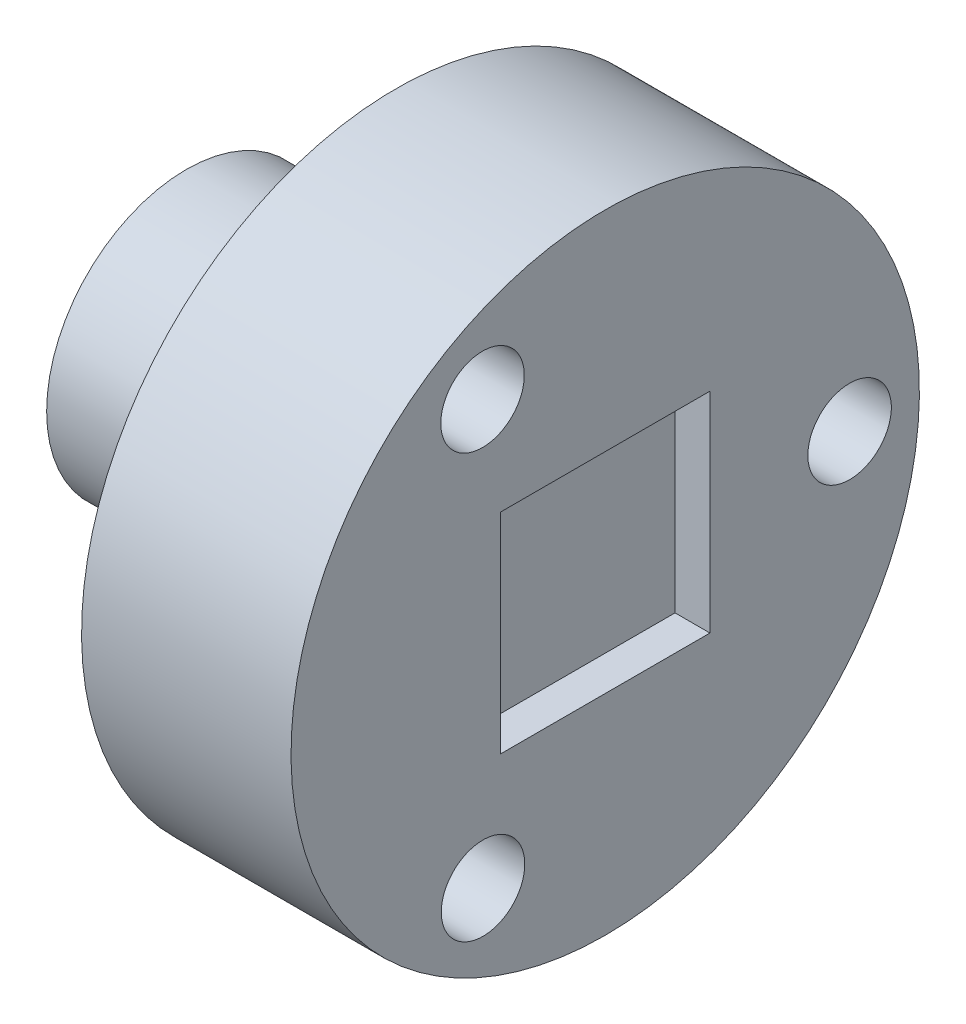
ISO-10303-21;
HEADER;
FILE_DESCRIPTION(('STEP AP214'),'2;1');
FILE_NAME('part.step','',(''),(''),'','','');
FILE_SCHEMA(('AUTOMOTIVE_DESIGN { 1 0 10303 214 1 1 1 1 }'));
ENDSEC;
DATA;
#1=APPLICATION_CONTEXT('core data for automotive mechanical design processes');
#2=APPLICATION_PROTOCOL_DEFINITION('international standard','automotive_design',2000,#1);
#3=PRODUCT_CONTEXT('',#1,'mechanical');
#4=PRODUCT('Part','Part','',(#3));
#5=PRODUCT_RELATED_PRODUCT_CATEGORY('part','',(#4));
#6=PRODUCT_DEFINITION_FORMATION('','',#4);
#7=PRODUCT_DEFINITION_CONTEXT('part definition',#1,'design');
#8=PRODUCT_DEFINITION('design','',#6,#7);
#9=PRODUCT_DEFINITION_SHAPE('','',#8);
#10=(LENGTH_UNIT() NAMED_UNIT(*) SI_UNIT(.MILLI.,.METRE.));
#11=(NAMED_UNIT(*) PLANE_ANGLE_UNIT() SI_UNIT($,.RADIAN.));
#12=(NAMED_UNIT(*) SI_UNIT($,.STERADIAN.) SOLID_ANGLE_UNIT());
#13=UNCERTAINTY_MEASURE_WITH_UNIT(LENGTH_MEASURE(1.E-05),#10,'distance_accuracy_value','');
#14=(GEOMETRIC_REPRESENTATION_CONTEXT(3) GLOBAL_UNCERTAINTY_ASSIGNED_CONTEXT((#13)) GLOBAL_UNIT_ASSIGNED_CONTEXT((#10,
#11,#12)) REPRESENTATION_CONTEXT('',''));
#15=CARTESIAN_POINT('',(0.,0.,0.));
#16=DIRECTION('',(0.,0.,1.));
#17=DIRECTION('',(1.,0.,0.));
#18=AXIS2_PLACEMENT_3D('',#15,#16,#17);
#19=CARTESIAN_POINT('',(-35.2061340470513,0.,0.));
#20=DIRECTION('',(-1.,0.,0.));
#21=DIRECTION('',(0.,-1.,0.));
#22=AXIS2_PLACEMENT_3D('',#19,#20,#21);
#23=CYLINDRICAL_SURFACE('',#22,4.1148);
#24=CARTESIAN_POINT('',(-12.7,0.,0.));
#25=DIRECTION('',(-1.,0.,0.));
#26=DIRECTION('',(0.,-1.,0.));
#27=AXIS2_PLACEMENT_3D('',#24,#25,#26);
#28=CIRCLE('',#27,4.1148);
#29=CARTESIAN_POINT('',(-12.7,-4.1148,0.));
#30=VERTEX_POINT('',#29);
#31=EDGE_CURVE('E133',#30,#30,#28,.T.);
#32=ORIENTED_EDGE('',*,*,#31,.F.);
#33=EDGE_LOOP('',(#32));
#34=FACE_BOUND('',#33,.T.);
#35=CARTESIAN_POINT('',(-19.05,0.,0.));
#36=DIRECTION('',(-1.,0.,0.));
#37=DIRECTION('',(0.,-1.,0.));
#38=AXIS2_PLACEMENT_3D('',#35,#36,#37);
#39=CIRCLE('',#38,4.1148);
#40=CARTESIAN_POINT('',(-19.05,-4.11480000000001,0.));
#41=VERTEX_POINT('',#40);
#42=EDGE_CURVE('E113',#41,#41,#39,.T.);
#43=ORIENTED_EDGE('',*,*,#42,.T.);
#44=EDGE_LOOP('',(#43));
#45=FACE_BOUND('',#44,.T.);
#46=ADVANCED_FACE('F35',(#34,#45),#23,.F.);
#47=CARTESIAN_POINT('',(-12.7,0.,0.));
#48=DIRECTION('',(1.,0.,0.));
#49=DIRECTION('',(0.,1.,0.));
#50=AXIS2_PLACEMENT_3D('',#47,#48,#49);
#51=PLANE('',#50);
#52=CARTESIAN_POINT('',(-12.7,0.,0.));
#53=DIRECTION('',(-1.,0.,0.));
#54=DIRECTION('',(0.,-1.,0.));
#55=AXIS2_PLACEMENT_3D('',#52,#53,#54);
#56=CIRCLE('',#55,3.175);
#57=CARTESIAN_POINT('',(-12.7,-3.175,0.));
#58=VERTEX_POINT('',#57);
#59=EDGE_CURVE('E130',#58,#58,#56,.T.);
#60=ORIENTED_EDGE('',*,*,#59,.F.);
#61=EDGE_LOOP('',(#60));
#62=FACE_BOUND('',#61,.T.);
#63=ORIENTED_EDGE('',*,*,#31,.T.);
#64=EDGE_LOOP('',(#63));
#65=FACE_BOUND('',#64,.T.);
#66=ADVANCED_FACE('F154',(#62,#65),#51,.F.);
#67=CARTESIAN_POINT('',(-35.2061340470513,0.,0.));
#68=DIRECTION('',(-1.,0.,0.));
#69=DIRECTION('',(0.,-1.,0.));
#70=AXIS2_PLACEMENT_3D('',#67,#68,#69);
#71=CYLINDRICAL_SURFACE('',#70,3.175);
#72=ORIENTED_EDGE('',*,*,#59,.T.);
#73=EDGE_LOOP('',(#72));
#74=FACE_BOUND('',#73,.T.);
#75=CARTESIAN_POINT('',(-19.05,0.,0.));
#76=DIRECTION('',(-1.,0.,0.));
#77=DIRECTION('',(0.,-1.,0.));
#78=AXIS2_PLACEMENT_3D('',#75,#76,#77);
#79=CIRCLE('',#78,3.175);
#80=CARTESIAN_POINT('',(-19.05,-3.175,0.));
#81=VERTEX_POINT('',#80);
#82=EDGE_CURVE('E127',#81,#81,#79,.T.);
#83=ORIENTED_EDGE('',*,*,#82,.F.);
#84=EDGE_LOOP('',(#83));
#85=FACE_BOUND('',#84,.T.);
#86=ADVANCED_FACE('F159',(#74,#85),#71,.T.);
#87=CARTESIAN_POINT('',(-19.05,0.,0.));
#88=DIRECTION('',(-1.,0.,0.));
#89=DIRECTION('',(0.,-1.,0.));
#90=AXIS2_PLACEMENT_3D('',#87,#88,#89);
#91=PLANE('',#90);
#92=ORIENTED_EDGE('',*,*,#82,.T.);
#93=EDGE_LOOP('',(#92));
#94=FACE_BOUND('',#93,.T.);
#95=ADVANCED_FACE('F167',(#94),#91,.T.);
#96=CARTESIAN_POINT('',(0.,0.,0.));
#97=DIRECTION('',(-1.,0.,0.));
#98=DIRECTION('',(0.,-1.,0.));
#99=AXIS2_PLACEMENT_3D('',#96,#97,#98);
#100=PLANE('',#99);
#101=CARTESIAN_POINT('',(0.,0.,-11.1125));
#102=DIRECTION('',(-1.,0.,0.));
#103=DIRECTION('',(0.,0.,1.));
#104=AXIS2_PLACEMENT_3D('',#101,#102,#103);
#105=CIRCLE('',#104,1.89865);
#106=CARTESIAN_POINT('',(0.,0.,-9.21385));
#107=VERTEX_POINT('',#106);
#108=EDGE_CURVE('E228',#107,#107,#105,.T.);
#109=ORIENTED_EDGE('',*,*,#108,.T.);
#110=EDGE_LOOP('',(#109));
#111=FACE_BOUND('',#110,.T.);
#112=CARTESIAN_POINT('',(0.,9.61112494740271,5.57798650907416));
#113=DIRECTION('',(-1.,0.,0.));
#114=DIRECTION('',(0.,0.,1.));
#115=AXIS2_PLACEMENT_3D('',#112,#113,#114);
#116=CIRCLE('',#115,1.89865);
#117=CARTESIAN_POINT('',(0.,9.61112494740271,7.47663650907416));
#118=VERTEX_POINT('',#117);
#119=EDGE_CURVE('E239',#118,#118,#116,.T.);
#120=ORIENTED_EDGE('',*,*,#119,.T.);
#121=EDGE_LOOP('',(#120));
#122=FACE_BOUND('',#121,.T.);
#123=CARTESIAN_POINT('',(0.,-9.64882284467833,5.55622161793419));
#124=DIRECTION('',(-1.,0.,0.));
#125=DIRECTION('',(0.,0.,1.));
#126=AXIS2_PLACEMENT_3D('',#123,#124,#125);
#127=CIRCLE('',#126,1.89865);
#128=CARTESIAN_POINT('',(0.,-9.64882284467833,7.45487161793419));
#129=VERTEX_POINT('',#128);
#130=EDGE_CURVE('E107',#129,#129,#127,.T.);
#131=ORIENTED_EDGE('',*,*,#130,.T.);
#132=EDGE_LOOP('',(#131));
#133=FACE_BOUND('',#132,.T.);
#134=DIRECTION('',(0.,0.,1.));
#135=VECTOR('',#134,1.);
#136=CARTESIAN_POINT('',(0.,4.7625,4.7625));
#137=LINE('',#136,#135);
#138=CARTESIAN_POINT('',(0.,4.7625,-4.7625));
#139=VERTEX_POINT('',#138);
#140=CARTESIAN_POINT('',(0.,4.7625,4.7625));
#141=VERTEX_POINT('',#140);
#142=EDGE_CURVE('E85',#139,#141,#137,.T.);
#143=ORIENTED_EDGE('',*,*,#142,.F.);
#144=DIRECTION('',(0.,1.,0.));
#145=VECTOR('',#144,1.);
#146=CARTESIAN_POINT('',(0.,4.7625,-4.7625));
#147=LINE('',#146,#145);
#148=CARTESIAN_POINT('',(0.,-4.7625,-4.7625));
#149=VERTEX_POINT('',#148);
#150=EDGE_CURVE('E50',#149,#139,#147,.T.);
#151=ORIENTED_EDGE('',*,*,#150,.F.);
#152=DIRECTION('',(0.,0.,-1.));
#153=VECTOR('',#152,1.);
#154=CARTESIAN_POINT('',(0.,-4.7625,4.7625));
#155=LINE('',#154,#153);
#156=CARTESIAN_POINT('',(0.,-4.7625,4.7625));
#157=VERTEX_POINT('',#156);
#158=EDGE_CURVE('E101',#157,#149,#155,.T.);
#159=ORIENTED_EDGE('',*,*,#158,.F.);
#160=DIRECTION('',(0.,-1.,0.));
#161=VECTOR('',#160,1.);
#162=CARTESIAN_POINT('',(0.,4.7625,4.7625));
#163=LINE('',#162,#161);
#164=EDGE_CURVE('E109',#141,#157,#163,.T.);
#165=ORIENTED_EDGE('',*,*,#164,.F.);
#166=EDGE_LOOP('',(#143,#151,#159,#165));
#167=FACE_BOUND('',#166,.T.);
#168=CARTESIAN_POINT('',(0.,0.,0.));
#169=DIRECTION('',(-1.,0.,0.));
#170=DIRECTION('',(0.,-1.,0.));
#171=AXIS2_PLACEMENT_3D('',#168,#169,#170);
#172=CIRCLE('',#171,14.2875);
#173=CARTESIAN_POINT('',(0.,-14.2875,0.));
#174=VERTEX_POINT('',#173);
#175=EDGE_CURVE('E124',#174,#174,#172,.T.);
#176=ORIENTED_EDGE('',*,*,#175,.F.);
#177=EDGE_LOOP('',(#176));
#178=FACE_BOUND('',#177,.T.);
#179=ADVANCED_FACE('F171',(#111,#122,#133,#167,#178),#100,.F.);
#180=CARTESIAN_POINT('',(-35.2061340470513,0.,0.));
#181=DIRECTION('',(-1.,0.,0.));
#182=DIRECTION('',(0.,-1.,0.));
#183=AXIS2_PLACEMENT_3D('',#180,#181,#182);
#184=CYLINDRICAL_SURFACE('',#183,14.2875);
#185=CARTESIAN_POINT('',(-9.525,0.,0.));
#186=DIRECTION('',(-1.,0.,0.));
#187=DIRECTION('',(0.,-1.,0.));
#188=AXIS2_PLACEMENT_3D('',#185,#186,#187);
#189=CIRCLE('',#188,14.2875);
#190=CARTESIAN_POINT('',(-9.525,-14.2875,0.));
#191=VERTEX_POINT('',#190);
#192=EDGE_CURVE('E121',#191,#191,#189,.T.);
#193=ORIENTED_EDGE('',*,*,#192,.F.);
#194=EDGE_LOOP('',(#193));
#195=FACE_BOUND('',#194,.T.);
#196=ORIENTED_EDGE('',*,*,#175,.T.);
#197=EDGE_LOOP('',(#196));
#198=FACE_BOUND('',#197,.T.);
#199=ADVANCED_FACE('F175',(#195,#198),#184,.T.);
#200=CARTESIAN_POINT('',(-9.525,0.,0.));
#201=DIRECTION('',(-1.,0.,0.));
#202=DIRECTION('',(0.,-1.,0.));
#203=AXIS2_PLACEMENT_3D('',#200,#201,#202);
#204=PLANE('',#203);
#205=CARTESIAN_POINT('',(-9.525,0.,-11.1125));
#206=DIRECTION('',(-1.,0.,0.));
#207=DIRECTION('',(0.,0.,1.));
#208=AXIS2_PLACEMENT_3D('',#205,#206,#207);
#209=CIRCLE('',#208,2.53365);
#210=CARTESIAN_POINT('',(-9.525,0.,-8.57885));
#211=VERTEX_POINT('',#210);
#212=EDGE_CURVE('E226',#211,#211,#209,.T.);
#213=ORIENTED_EDGE('',*,*,#212,.F.);
#214=EDGE_LOOP('',(#213));
#215=FACE_BOUND('',#214,.T.);
#216=CARTESIAN_POINT('',(-9.525,9.61112494740271,5.57798650907416));
#217=DIRECTION('',(-1.,0.,0.));
#218=DIRECTION('',(0.,0.,1.));
#219=AXIS2_PLACEMENT_3D('',#216,#217,#218);
#220=CIRCLE('',#219,2.53365);
#221=CARTESIAN_POINT('',(-9.525,9.61112494740271,8.11163650907416));
#222=VERTEX_POINT('',#221);
#223=EDGE_CURVE('E233',#222,#222,#220,.T.);
#224=ORIENTED_EDGE('',*,*,#223,.F.);
#225=EDGE_LOOP('',(#224));
#226=FACE_BOUND('',#225,.T.);
#227=CARTESIAN_POINT('',(-9.525,-9.64882284467833,5.55622161793419));
#228=DIRECTION('',(-1.,0.,0.));
#229=DIRECTION('',(0.,0.,1.));
#230=AXIS2_PLACEMENT_3D('',#227,#228,#229);
#231=CIRCLE('',#230,2.53365);
#232=CARTESIAN_POINT('',(-9.525,-9.64882284467833,8.08987161793419));
#233=VERTEX_POINT('',#232);
#234=EDGE_CURVE('E242',#233,#233,#231,.T.);
#235=ORIENTED_EDGE('',*,*,#234,.F.);
#236=EDGE_LOOP('',(#235));
#237=FACE_BOUND('',#236,.T.);
#238=CARTESIAN_POINT('',(-9.525,0.,0.));
#239=DIRECTION('',(-1.,0.,0.));
#240=DIRECTION('',(0.,-1.,0.));
#241=AXIS2_PLACEMENT_3D('',#238,#239,#240);
#242=CIRCLE('',#241,7.9375);
#243=CARTESIAN_POINT('',(-9.525,-7.9375,0.));
#244=VERTEX_POINT('',#243);
#245=EDGE_CURVE('E11',#244,#244,#242,.F.);
#246=ORIENTED_EDGE('',*,*,#245,.T.);
#247=EDGE_LOOP('',(#246));
#248=FACE_BOUND('',#247,.T.);
#249=ORIENTED_EDGE('',*,*,#192,.T.);
#250=EDGE_LOOP('',(#249));
#251=FACE_BOUND('',#250,.T.);
#252=ADVANCED_FACE('F179',(#215,#226,#237,#248,#251),#204,.T.);
#253=CARTESIAN_POINT('',(-35.2061340470513,0.,0.));
#254=DIRECTION('',(-1.,0.,0.));
#255=DIRECTION('',(0.,-1.,0.));
#256=AXIS2_PLACEMENT_3D('',#253,#254,#255);
#257=CYLINDRICAL_SURFACE('',#256,6.35);
#258=CARTESIAN_POINT('',(-11.1125,0.,0.));
#259=DIRECTION('',(-1.,0.,0.));
#260=DIRECTION('',(0.,-1.,0.));
#261=AXIS2_PLACEMENT_3D('',#258,#259,#260);
#262=CIRCLE('',#261,6.35);
#263=CARTESIAN_POINT('',(-11.1125,-6.35,0.));
#264=VERTEX_POINT('',#263);
#265=EDGE_CURVE('E43',#264,#264,#262,.T.);
#266=ORIENTED_EDGE('',*,*,#265,.T.);
#267=EDGE_LOOP('',(#266));
#268=FACE_BOUND('',#267,.T.);
#269=CARTESIAN_POINT('',(-19.05,0.,0.));
#270=DIRECTION('',(-1.,0.,0.));
#271=DIRECTION('',(0.,-1.,0.));
#272=AXIS2_PLACEMENT_3D('',#269,#270,#271);
#273=CIRCLE('',#272,6.35);
#274=CARTESIAN_POINT('',(-19.05,-6.35,0.));
#275=VERTEX_POINT('',#274);
#276=EDGE_CURVE('E118',#275,#275,#273,.T.);
#277=ORIENTED_EDGE('',*,*,#276,.F.);
#278=EDGE_LOOP('',(#277));
#279=FACE_BOUND('',#278,.T.);
#280=ADVANCED_FACE('F138',(#268,#279),#257,.T.);
#281=CARTESIAN_POINT('',(-19.05,0.,0.));
#282=DIRECTION('',(-1.,0.,0.));
#283=DIRECTION('',(0.,-1.,0.));
#284=AXIS2_PLACEMENT_3D('',#281,#282,#283);
#285=PLANE('',#284);
#286=ORIENTED_EDGE('',*,*,#276,.T.);
#287=EDGE_LOOP('',(#286));
#288=FACE_BOUND('',#287,.T.);
#289=ORIENTED_EDGE('',*,*,#42,.F.);
#290=EDGE_LOOP('',(#289));
#291=FACE_BOUND('',#290,.T.);
#292=ADVANCED_FACE('F186',(#288,#291),#285,.T.);
#293=CARTESIAN_POINT('',(-1.5875,4.7625,-4.7625));
#294=DIRECTION('',(0.,0.,-1.));
#295=DIRECTION('',(0.,1.,0.));
#296=AXIS2_PLACEMENT_3D('',#293,#294,#295);
#297=PLANE('',#296);
#298=ORIENTED_EDGE('',*,*,#150,.T.);
#299=DIRECTION('',(1.,0.,0.));
#300=VECTOR('',#299,1.);
#301=CARTESIAN_POINT('',(-1.5875,4.7625,-4.7625));
#302=LINE('',#301,#300);
#303=CARTESIAN_POINT('',(-1.5875,4.7625,-4.7625));
#304=VERTEX_POINT('',#303);
#305=EDGE_CURVE('E73',#304,#139,#302,.T.);
#306=ORIENTED_EDGE('',*,*,#305,.F.);
#307=DIRECTION('',(0.,1.,0.));
#308=VECTOR('',#307,1.);
#309=CARTESIAN_POINT('',(-1.5875,4.7625,-4.7625));
#310=LINE('',#309,#308);
#311=CARTESIAN_POINT('',(-1.5875,-4.7625,-4.7625));
#312=VERTEX_POINT('',#311);
#313=EDGE_CURVE('E99',#312,#304,#310,.T.);
#314=ORIENTED_EDGE('',*,*,#313,.F.);
#315=DIRECTION('',(1.,0.,0.));
#316=VECTOR('',#315,1.);
#317=CARTESIAN_POINT('',(-1.5875,-4.7625,-4.7625));
#318=LINE('',#317,#316);
#319=EDGE_CURVE('E58',#312,#149,#318,.T.);
#320=ORIENTED_EDGE('',*,*,#319,.T.);
#321=EDGE_LOOP('',(#298,#306,#314,#320));
#322=FACE_BOUND('',#321,.T.);
#323=ADVANCED_FACE('F189',(#322),#297,.F.);
#324=CARTESIAN_POINT('',(-1.5875,-4.7625,4.7625));
#325=DIRECTION('',(0.,-1.,0.));
#326=DIRECTION('',(1.,0.,0.));
#327=AXIS2_PLACEMENT_3D('',#324,#325,#326);
#328=PLANE('',#327);
#329=ORIENTED_EDGE('',*,*,#158,.T.);
#330=ORIENTED_EDGE('',*,*,#319,.F.);
#331=DIRECTION('',(0.,0.,-1.));
#332=VECTOR('',#331,1.);
#333=CARTESIAN_POINT('',(-1.5875,-4.7625,4.7625));
#334=LINE('',#333,#332);
#335=CARTESIAN_POINT('',(-1.5875,-4.7625,4.7625));
#336=VERTEX_POINT('',#335);
#337=EDGE_CURVE('E96',#336,#312,#334,.T.);
#338=ORIENTED_EDGE('',*,*,#337,.F.);
#339=DIRECTION('',(1.,0.,0.));
#340=VECTOR('',#339,1.);
#341=CARTESIAN_POINT('',(-1.5875,-4.7625,4.7625));
#342=LINE('',#341,#340);
#343=EDGE_CURVE('E89',#336,#157,#342,.T.);
#344=ORIENTED_EDGE('',*,*,#343,.T.);
#345=EDGE_LOOP('',(#329,#330,#338,#344));
#346=FACE_BOUND('',#345,.T.);
#347=ADVANCED_FACE('F193',(#346),#328,.F.);
#348=CARTESIAN_POINT('',(-1.5875,4.7625,4.7625));
#349=DIRECTION('',(0.,0.,1.));
#350=DIRECTION('',(1.,0.,0.));
#351=AXIS2_PLACEMENT_3D('',#348,#349,#350);
#352=PLANE('',#351);
#353=ORIENTED_EDGE('',*,*,#164,.T.);
#354=ORIENTED_EDGE('',*,*,#343,.F.);
#355=DIRECTION('',(0.,-1.,0.));
#356=VECTOR('',#355,1.);
#357=CARTESIAN_POINT('',(-1.5875,4.7625,4.7625));
#358=LINE('',#357,#356);
#359=CARTESIAN_POINT('',(-1.5875,4.7625,4.7625));
#360=VERTEX_POINT('',#359);
#361=EDGE_CURVE('E92',#360,#336,#358,.T.);
#362=ORIENTED_EDGE('',*,*,#361,.F.);
#363=DIRECTION('',(1.,0.,0.));
#364=VECTOR('',#363,1.);
#365=CARTESIAN_POINT('',(-1.5875,4.7625,4.7625));
#366=LINE('',#365,#364);
#367=EDGE_CURVE('E78',#360,#141,#366,.T.);
#368=ORIENTED_EDGE('',*,*,#367,.T.);
#369=EDGE_LOOP('',(#353,#354,#362,#368));
#370=FACE_BOUND('',#369,.T.);
#371=ADVANCED_FACE('F93',(#370),#352,.F.);
#372=CARTESIAN_POINT('',(-1.5875,4.7625,4.7625));
#373=DIRECTION('',(0.,1.,0.));
#374=DIRECTION('',(-1.,0.,0.));
#375=AXIS2_PLACEMENT_3D('',#372,#373,#374);
#376=PLANE('',#375);
#377=ORIENTED_EDGE('',*,*,#142,.T.);
#378=ORIENTED_EDGE('',*,*,#367,.F.);
#379=DIRECTION('',(0.,0.,1.));
#380=VECTOR('',#379,1.);
#381=CARTESIAN_POINT('',(-1.5875,4.7625,4.7625));
#382=LINE('',#381,#380);
#383=EDGE_CURVE('E82',#304,#360,#382,.T.);
#384=ORIENTED_EDGE('',*,*,#383,.F.);
#385=ORIENTED_EDGE('',*,*,#305,.T.);
#386=EDGE_LOOP('',(#377,#378,#384,#385));
#387=FACE_BOUND('',#386,.T.);
#388=ADVANCED_FACE('F80',(#387),#376,.F.);
#389=CARTESIAN_POINT('',(-1.5875,0.,0.));
#390=DIRECTION('',(1.,0.,0.));
#391=DIRECTION('',(0.,1.,0.));
#392=AXIS2_PLACEMENT_3D('',#389,#390,#391);
#393=PLANE('',#392);
#394=ORIENTED_EDGE('',*,*,#313,.T.);
#395=ORIENTED_EDGE('',*,*,#383,.T.);
#396=ORIENTED_EDGE('',*,*,#361,.T.);
#397=ORIENTED_EDGE('',*,*,#337,.T.);
#398=EDGE_LOOP('',(#394,#395,#396,#397));
#399=FACE_BOUND('',#398,.T.);
#400=ADVANCED_FACE('F98',(#399),#393,.T.);
#401=CARTESIAN_POINT('',(-11.1125,0.,0.));
#402=DIRECTION('',(-1.,0.,0.));
#403=DIRECTION('',(0.,-1.,0.));
#404=AXIS2_PLACEMENT_3D('',#401,#402,#403);
#405=TOROIDAL_SURFACE('',#404,7.9375,1.5875);
#406=ORIENTED_EDGE('',*,*,#245,.F.);
#407=EDGE_LOOP('',(#406));
#408=FACE_BOUND('',#407,.T.);
#409=ORIENTED_EDGE('',*,*,#265,.F.);
#410=EDGE_LOOP('',(#409));
#411=FACE_BOUND('',#410,.T.);
#412=ADVANCED_FACE('F37',(#408,#411),#405,.F.);
#413=CARTESIAN_POINT('',(-9.525,-9.64882284467833,5.55622161793419));
#414=DIRECTION('',(-1.,0.,0.));
#415=DIRECTION('',(0.,0.,1.));
#416=AXIS2_PLACEMENT_3D('',#413,#414,#415);
#417=CYLINDRICAL_SURFACE('',#416,1.89865);
#418=ORIENTED_EDGE('',*,*,#130,.F.);
#419=EDGE_LOOP('',(#418));
#420=FACE_BOUND('',#419,.T.);
#421=CARTESIAN_POINT('',(-8.89,-9.64882284467833,5.55622161793419));
#422=DIRECTION('',(-1.,0.,0.));
#423=DIRECTION('',(0.,0.,1.));
#424=AXIS2_PLACEMENT_3D('',#421,#422,#423);
#425=CIRCLE('',#424,1.89865);
#426=CARTESIAN_POINT('',(-8.89,-9.64882284467833,7.45487161793419));
#427=VERTEX_POINT('',#426);
#428=EDGE_CURVE('E245',#427,#427,#425,.T.);
#429=ORIENTED_EDGE('',*,*,#428,.T.);
#430=EDGE_LOOP('',(#429));
#431=FACE_BOUND('',#430,.T.);
#432=ADVANCED_FACE('F142',(#420,#431),#417,.F.);
#433=CARTESIAN_POINT('',(-9.525,-9.64882284467833,5.55622161793419));
#434=DIRECTION('',(-1.,0.,0.));
#435=DIRECTION('',(0.,0.,1.));
#436=AXIS2_PLACEMENT_3D('',#433,#434,#435);
#437=CONICAL_SURFACE('',#436,2.53365,0.785398163397447);
#438=ORIENTED_EDGE('',*,*,#428,.F.);
#439=EDGE_LOOP('',(#438));
#440=FACE_BOUND('',#439,.T.);
#441=ORIENTED_EDGE('',*,*,#234,.T.);
#442=EDGE_LOOP('',(#441));
#443=FACE_BOUND('',#442,.T.);
#444=ADVANCED_FACE('F148',(#440,#443),#437,.F.);
#445=CARTESIAN_POINT('',(-9.525,9.61112494740271,5.57798650907416));
#446=DIRECTION('',(-1.,0.,0.));
#447=DIRECTION('',(0.,0.,1.));
#448=AXIS2_PLACEMENT_3D('',#445,#446,#447);
#449=CYLINDRICAL_SURFACE('',#448,1.89865);
#450=ORIENTED_EDGE('',*,*,#119,.F.);
#451=EDGE_LOOP('',(#450));
#452=FACE_BOUND('',#451,.T.);
#453=CARTESIAN_POINT('',(-8.89,9.61112494740271,5.57798650907416));
#454=DIRECTION('',(-1.,0.,0.));
#455=DIRECTION('',(0.,0.,1.));
#456=AXIS2_PLACEMENT_3D('',#453,#454,#455);
#457=CIRCLE('',#456,1.89865);
#458=CARTESIAN_POINT('',(-8.89,9.61112494740271,7.47663650907416));
#459=VERTEX_POINT('',#458);
#460=EDGE_CURVE('E236',#459,#459,#457,.T.);
#461=ORIENTED_EDGE('',*,*,#460,.T.);
#462=EDGE_LOOP('',(#461));
#463=FACE_BOUND('',#462,.T.);
#464=ADVANCED_FACE('F202',(#452,#463),#449,.F.);
#465=CARTESIAN_POINT('',(-9.525,9.61112494740271,5.57798650907416));
#466=DIRECTION('',(-1.,0.,0.));
#467=DIRECTION('',(0.,0.,1.));
#468=AXIS2_PLACEMENT_3D('',#465,#466,#467);
#469=CONICAL_SURFACE('',#468,2.53365,0.785398163397447);
#470=ORIENTED_EDGE('',*,*,#460,.F.);
#471=EDGE_LOOP('',(#470));
#472=FACE_BOUND('',#471,.T.);
#473=ORIENTED_EDGE('',*,*,#223,.T.);
#474=EDGE_LOOP('',(#473));
#475=FACE_BOUND('',#474,.T.);
#476=ADVANCED_FACE('F206',(#472,#475),#469,.F.);
#477=CARTESIAN_POINT('',(-9.525,0.,-11.1125));
#478=DIRECTION('',(-1.,0.,0.));
#479=DIRECTION('',(0.,0.,1.));
#480=AXIS2_PLACEMENT_3D('',#477,#478,#479);
#481=CYLINDRICAL_SURFACE('',#480,1.89865);
#482=ORIENTED_EDGE('',*,*,#108,.F.);
#483=EDGE_LOOP('',(#482));
#484=FACE_BOUND('',#483,.T.);
#485=CARTESIAN_POINT('',(-8.89,0.,-11.1125));
#486=DIRECTION('',(-1.,0.,0.));
#487=DIRECTION('',(0.,0.,1.));
#488=AXIS2_PLACEMENT_3D('',#485,#486,#487);
#489=CIRCLE('',#488,1.89865);
#490=CARTESIAN_POINT('',(-8.89,0.,-9.21385));
#491=VERTEX_POINT('',#490);
#492=EDGE_CURVE('E223',#491,#491,#489,.T.);
#493=ORIENTED_EDGE('',*,*,#492,.T.);
#494=EDGE_LOOP('',(#493));
#495=FACE_BOUND('',#494,.T.);
#496=ADVANCED_FACE('F210',(#484,#495),#481,.F.);
#497=CARTESIAN_POINT('',(-9.525,0.,-11.1125));
#498=DIRECTION('',(-1.,0.,0.));
#499=DIRECTION('',(0.,0.,1.));
#500=AXIS2_PLACEMENT_3D('',#497,#498,#499);
#501=CONICAL_SURFACE('',#500,2.53365,0.785398163397447);
#502=ORIENTED_EDGE('',*,*,#492,.F.);
#503=EDGE_LOOP('',(#502));
#504=FACE_BOUND('',#503,.T.);
#505=ORIENTED_EDGE('',*,*,#212,.T.);
#506=EDGE_LOOP('',(#505));
#507=FACE_BOUND('',#506,.T.);
#508=ADVANCED_FACE('F214',(#504,#507),#501,.F.);
#509=CLOSED_SHELL('',(#46,#66,#86,#95,#179,#199,#252,#280,#292,#323,#347,#371,#388,#400,#412,
#432,#444,#464,#476,#496,#508));
#510=MANIFOLD_SOLID_BREP('B2',#509);
#511=ADVANCED_BREP_SHAPE_REPRESENTATION('',(#18,#510),#14);
#512=SHAPE_DEFINITION_REPRESENTATION(#9,#511);
ENDSEC;
END-ISO-10303-21;
